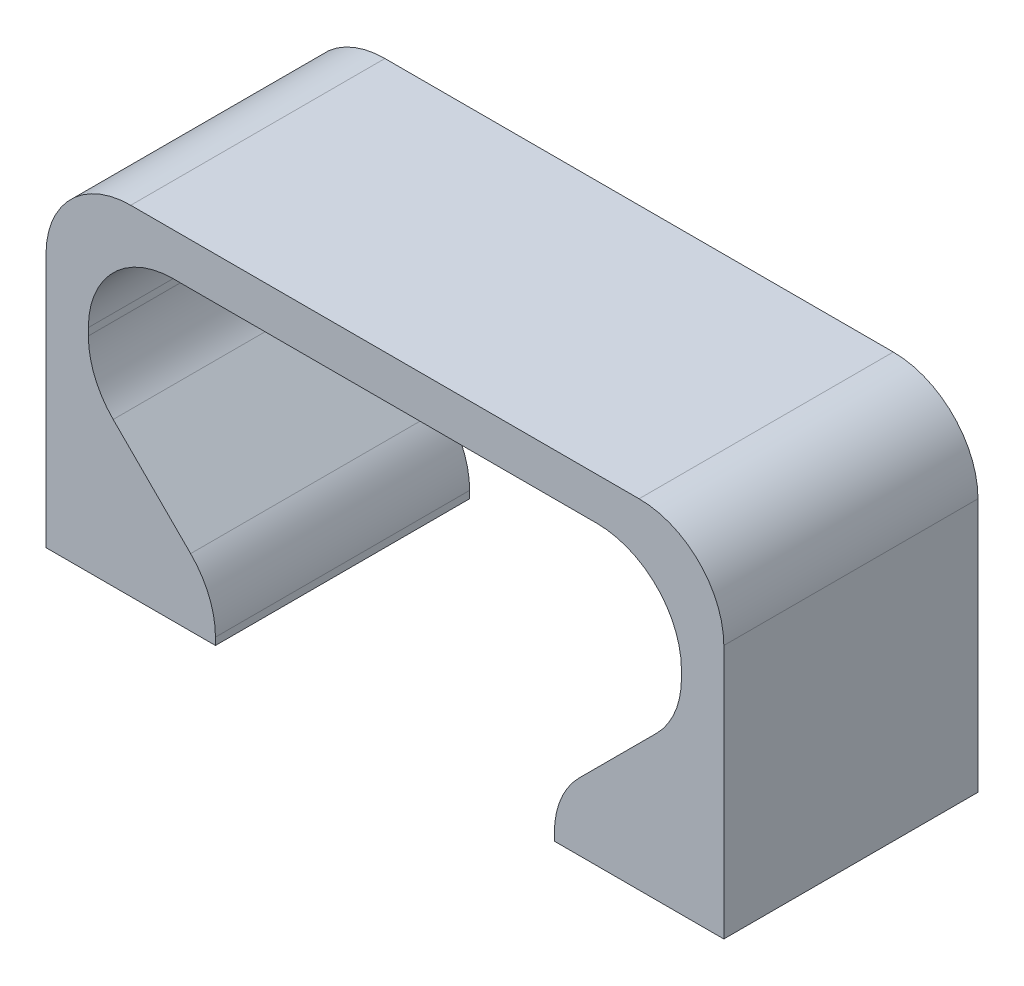
ISO-10303-21;
HEADER;
FILE_DESCRIPTION(('STEP AP214'),'2;1');
FILE_NAME('part.step','',(''),(''),'','','');
FILE_SCHEMA(('AUTOMOTIVE_DESIGN { 1 0 10303 214 1 1 1 1 }'));
ENDSEC;
DATA;
#1=APPLICATION_CONTEXT('core data for automotive mechanical design processes');
#2=APPLICATION_PROTOCOL_DEFINITION('international standard','automotive_design',2000,#1);
#3=PRODUCT_CONTEXT('',#1,'mechanical');
#4=PRODUCT('Part','Part','',(#3));
#5=PRODUCT_RELATED_PRODUCT_CATEGORY('part','',(#4));
#6=PRODUCT_DEFINITION_FORMATION('','',#4);
#7=PRODUCT_DEFINITION_CONTEXT('part definition',#1,'design');
#8=PRODUCT_DEFINITION('design','',#6,#7);
#9=PRODUCT_DEFINITION_SHAPE('','',#8);
#10=(LENGTH_UNIT() NAMED_UNIT(*) SI_UNIT(.MILLI.,.METRE.));
#11=(NAMED_UNIT(*) PLANE_ANGLE_UNIT() SI_UNIT($,.RADIAN.));
#12=(NAMED_UNIT(*) SI_UNIT($,.STERADIAN.) SOLID_ANGLE_UNIT());
#13=UNCERTAINTY_MEASURE_WITH_UNIT(LENGTH_MEASURE(1.E-05),#10,'distance_accuracy_value','');
#14=(GEOMETRIC_REPRESENTATION_CONTEXT(3) GLOBAL_UNCERTAINTY_ASSIGNED_CONTEXT((#13)) GLOBAL_UNIT_ASSIGNED_CONTEXT((#10,
#11,#12)) REPRESENTATION_CONTEXT('',''));
#15=CARTESIAN_POINT('',(0.,0.,0.));
#16=DIRECTION('',(0.,0.,1.));
#17=DIRECTION('',(1.,0.,0.));
#18=AXIS2_PLACEMENT_3D('',#15,#16,#17);
#19=CARTESIAN_POINT('',(-20.,0.,-7.5));
#20=DIRECTION('',(-1.,0.,0.));
#21=DIRECTION('',(0.,0.,1.));
#22=AXIS2_PLACEMENT_3D('',#19,#20,#21);
#23=PLANE('',#22);
#24=DIRECTION('',(0.,-1.,0.));
#25=VECTOR('',#24,1.);
#26=CARTESIAN_POINT('',(-20.,0.,7.5));
#27=LINE('',#26,#25);
#28=CARTESIAN_POINT('',(-20.,15.,7.5));
#29=VERTEX_POINT('',#28);
#30=CARTESIAN_POINT('',(-20.,0.,7.5));
#31=VERTEX_POINT('',#30);
#32=EDGE_CURVE('E173',#29,#31,#27,.T.);
#33=ORIENTED_EDGE('',*,*,#32,.F.);
#34=DIRECTION('',(0.,0.,1.));
#35=VECTOR('',#34,1.);
#36=CARTESIAN_POINT('',(-20.,15.,-7.5));
#37=LINE('',#36,#35);
#38=CARTESIAN_POINT('',(-20.,15.,-7.5));
#39=VERTEX_POINT('',#38);
#40=EDGE_CURVE('E307',#29,#39,#37,.F.);
#41=ORIENTED_EDGE('',*,*,#40,.T.);
#42=DIRECTION('',(0.,-1.,0.));
#43=VECTOR('',#42,1.);
#44=CARTESIAN_POINT('',(-20.,0.,-7.5));
#45=LINE('',#44,#43);
#46=CARTESIAN_POINT('',(-20.,0.,-7.5));
#47=VERTEX_POINT('',#46);
#48=EDGE_CURVE('E189',#39,#47,#45,.T.);
#49=ORIENTED_EDGE('',*,*,#48,.T.);
#50=DIRECTION('',(0.,0.,1.));
#51=VECTOR('',#50,1.);
#52=CARTESIAN_POINT('',(-20.,0.,-7.5));
#53=LINE('',#52,#51);
#54=EDGE_CURVE('E187',#47,#31,#53,.T.);
#55=ORIENTED_EDGE('',*,*,#54,.T.);
#56=EDGE_LOOP('',(#33,#41,#49,#55));
#57=FACE_BOUND('',#56,.T.);
#58=ADVANCED_FACE('F35',(#57),#23,.T.);
#59=CARTESIAN_POINT('',(-20.,20.,-7.5));
#60=DIRECTION('',(0.,1.,0.));
#61=DIRECTION('',(-1.,0.,0.));
#62=AXIS2_PLACEMENT_3D('',#59,#60,#61);
#63=PLANE('',#62);
#64=DIRECTION('',(-1.,0.,0.));
#65=VECTOR('',#64,1.);
#66=CARTESIAN_POINT('',(-20.,20.,7.5));
#67=LINE('',#66,#65);
#68=CARTESIAN_POINT('',(15.,20.,7.5));
#69=VERTEX_POINT('',#68);
#70=CARTESIAN_POINT('',(-15.,20.,7.5));
#71=VERTEX_POINT('',#70);
#72=EDGE_CURVE('E223',#69,#71,#67,.T.);
#73=ORIENTED_EDGE('',*,*,#72,.F.);
#74=DIRECTION('',(0.,0.,1.));
#75=VECTOR('',#74,1.);
#76=CARTESIAN_POINT('',(15.,20.,-7.5));
#77=LINE('',#76,#75);
#78=CARTESIAN_POINT('',(15.,20.,-7.5));
#79=VERTEX_POINT('',#78);
#80=EDGE_CURVE('E305',#69,#79,#77,.F.);
#81=ORIENTED_EDGE('',*,*,#80,.T.);
#82=DIRECTION('',(-1.,0.,0.));
#83=VECTOR('',#82,1.);
#84=CARTESIAN_POINT('',(-20.,20.,-7.5));
#85=LINE('',#84,#83);
#86=CARTESIAN_POINT('',(-15.,20.,-7.5));
#87=VERTEX_POINT('',#86);
#88=EDGE_CURVE('E194',#79,#87,#85,.T.);
#89=ORIENTED_EDGE('',*,*,#88,.T.);
#90=DIRECTION('',(0.,0.,1.));
#91=VECTOR('',#90,1.);
#92=CARTESIAN_POINT('',(-15.,20.,-7.5));
#93=LINE('',#92,#91);
#94=EDGE_CURVE('E302',#87,#71,#93,.T.);
#95=ORIENTED_EDGE('',*,*,#94,.T.);
#96=EDGE_LOOP('',(#73,#81,#89,#95));
#97=FACE_BOUND('',#96,.T.);
#98=ADVANCED_FACE('F358',(#97),#63,.T.);
#99=CARTESIAN_POINT('',(20.,20.,-7.5));
#100=DIRECTION('',(1.,0.,0.));
#101=DIRECTION('',(0.,1.,0.));
#102=AXIS2_PLACEMENT_3D('',#99,#100,#101);
#103=PLANE('',#102);
#104=DIRECTION('',(0.,1.,0.));
#105=VECTOR('',#104,1.);
#106=CARTESIAN_POINT('',(20.,20.,-7.5));
#107=LINE('',#106,#105);
#108=CARTESIAN_POINT('',(20.,0.,-7.5));
#109=VERTEX_POINT('',#108);
#110=CARTESIAN_POINT('',(20.,15.,-7.5));
#111=VERTEX_POINT('',#110);
#112=EDGE_CURVE('E249',#109,#111,#107,.T.);
#113=ORIENTED_EDGE('',*,*,#112,.T.);
#114=DIRECTION('',(0.,0.,1.));
#115=VECTOR('',#114,1.);
#116=CARTESIAN_POINT('',(20.,15.,-7.5));
#117=LINE('',#116,#115);
#118=CARTESIAN_POINT('',(20.,15.,7.5));
#119=VERTEX_POINT('',#118);
#120=EDGE_CURVE('E299',#111,#119,#117,.T.);
#121=ORIENTED_EDGE('',*,*,#120,.T.);
#122=DIRECTION('',(0.,1.,0.));
#123=VECTOR('',#122,1.);
#124=CARTESIAN_POINT('',(20.,20.,7.5));
#125=LINE('',#124,#123);
#126=CARTESIAN_POINT('',(20.,0.,7.5));
#127=VERTEX_POINT('',#126);
#128=EDGE_CURVE('E220',#127,#119,#125,.T.);
#129=ORIENTED_EDGE('',*,*,#128,.F.);
#130=DIRECTION('',(0.,0.,1.));
#131=VECTOR('',#130,1.);
#132=CARTESIAN_POINT('',(20.,0.,-7.5));
#133=LINE('',#132,#131);
#134=EDGE_CURVE('E254',#109,#127,#133,.T.);
#135=ORIENTED_EDGE('',*,*,#134,.F.);
#136=EDGE_LOOP('',(#113,#121,#129,#135));
#137=FACE_BOUND('',#136,.T.);
#138=ADVANCED_FACE('F366',(#137),#103,.T.);
#139=CARTESIAN_POINT('',(20.,0.,-7.5));
#140=DIRECTION('',(0.,-1.,0.));
#141=DIRECTION('',(1.,0.,0.));
#142=AXIS2_PLACEMENT_3D('',#139,#140,#141);
#143=PLANE('',#142);
#144=ORIENTED_EDGE('',*,*,#134,.T.);
#145=DIRECTION('',(1.,0.,0.));
#146=VECTOR('',#145,1.);
#147=CARTESIAN_POINT('',(20.,0.,7.5));
#148=LINE('',#147,#146);
#149=CARTESIAN_POINT('',(10.,0.,7.5));
#150=VERTEX_POINT('',#149);
#151=EDGE_CURVE('E217',#150,#127,#148,.T.);
#152=ORIENTED_EDGE('',*,*,#151,.F.);
#153=DIRECTION('',(0.,0.,1.));
#154=VECTOR('',#153,1.);
#155=CARTESIAN_POINT('',(10.,0.,-7.5));
#156=LINE('',#155,#154);
#157=CARTESIAN_POINT('',(10.,0.,-7.5));
#158=VERTEX_POINT('',#157);
#159=EDGE_CURVE('E257',#158,#150,#156,.T.);
#160=ORIENTED_EDGE('',*,*,#159,.F.);
#161=DIRECTION('',(1.,0.,0.));
#162=VECTOR('',#161,1.);
#163=CARTESIAN_POINT('',(20.,0.,-7.5));
#164=LINE('',#163,#162);
#165=EDGE_CURVE('E246',#158,#109,#164,.T.);
#166=ORIENTED_EDGE('',*,*,#165,.T.);
#167=EDGE_LOOP('',(#144,#152,#160,#166));
#168=FACE_BOUND('',#167,.T.);
#169=ADVANCED_FACE('F371',(#168),#143,.T.);
#170=CARTESIAN_POINT('',(10.,0.,-7.5));
#171=DIRECTION('',(-1.,0.,0.));
#172=DIRECTION('',(0.,0.,1.));
#173=AXIS2_PLACEMENT_3D('',#170,#171,#172);
#174=PLANE('',#173);
#175=DIRECTION('',(0.,-1.,0.));
#176=VECTOR('',#175,1.);
#177=CARTESIAN_POINT('',(10.,0.,7.5));
#178=LINE('',#177,#176);
#179=CARTESIAN_POINT('',(10.,0.428932188134523,7.5));
#180=VERTEX_POINT('',#179);
#181=EDGE_CURVE('E215',#180,#150,#178,.T.);
#182=ORIENTED_EDGE('',*,*,#181,.F.);
#183=DIRECTION('',(0.,0.,1.));
#184=VECTOR('',#183,1.);
#185=CARTESIAN_POINT('',(10.,0.428932188134523,-7.5));
#186=LINE('',#185,#184);
#187=CARTESIAN_POINT('',(10.,0.428932188134523,-7.5));
#188=VERTEX_POINT('',#187);
#189=EDGE_CURVE('E277',#180,#188,#186,.F.);
#190=ORIENTED_EDGE('',*,*,#189,.T.);
#191=DIRECTION('',(0.,-1.,0.));
#192=VECTOR('',#191,1.);
#193=CARTESIAN_POINT('',(10.,0.,-7.5));
#194=LINE('',#193,#192);
#195=EDGE_CURVE('E244',#188,#158,#194,.T.);
#196=ORIENTED_EDGE('',*,*,#195,.T.);
#197=ORIENTED_EDGE('',*,*,#159,.T.);
#198=EDGE_LOOP('',(#182,#190,#196,#197));
#199=FACE_BOUND('',#198,.T.);
#200=ADVANCED_FACE('F375',(#199),#174,.T.);
#201=CARTESIAN_POINT('',(10.,2.5,-7.5));
#202=DIRECTION('',(-0.707106781186547,0.707106781186548,0.));
#203=DIRECTION('',(-0.707106781186548,-0.707106781186547,0.));
#204=AXIS2_PLACEMENT_3D('',#201,#202,#203);
#205=PLANE('',#204);
#206=DIRECTION('',(-0.707106781186548,-0.707106781186547,0.));
#207=VECTOR('',#206,1.);
#208=CARTESIAN_POINT('',(10.,2.5,7.5));
#209=LINE('',#208,#207);
#210=CARTESIAN_POINT('',(16.0355339059327,8.53553390593274,7.5));
#211=VERTEX_POINT('',#210);
#212=CARTESIAN_POINT('',(11.4644660940673,3.96446609406726,7.5));
#213=VERTEX_POINT('',#212);
#214=EDGE_CURVE('E213',#211,#213,#209,.T.);
#215=ORIENTED_EDGE('',*,*,#214,.F.);
#216=DIRECTION('',(0.,0.,1.));
#217=VECTOR('',#216,1.);
#218=CARTESIAN_POINT('',(16.0355339059327,8.53553390593274,-7.5));
#219=LINE('',#218,#217);
#220=CARTESIAN_POINT('',(16.0355339059327,8.53553390593274,-7.5));
#221=VERTEX_POINT('',#220);
#222=EDGE_CURVE('E268',#211,#221,#219,.F.);
#223=ORIENTED_EDGE('',*,*,#222,.T.);
#224=DIRECTION('',(-0.707106781186548,-0.707106781186547,0.));
#225=VECTOR('',#224,1.);
#226=CARTESIAN_POINT('',(10.,2.5,-7.5));
#227=LINE('',#226,#225);
#228=CARTESIAN_POINT('',(11.4644660940673,3.96446609406726,-7.5));
#229=VERTEX_POINT('',#228);
#230=EDGE_CURVE('E241',#221,#229,#227,.T.);
#231=ORIENTED_EDGE('',*,*,#230,.T.);
#232=DIRECTION('',(0.,0.,1.));
#233=VECTOR('',#232,1.);
#234=CARTESIAN_POINT('',(11.4644660940673,3.96446609406726,-7.5));
#235=LINE('',#234,#233);
#236=EDGE_CURVE('E265',#229,#213,#235,.T.);
#237=ORIENTED_EDGE('',*,*,#236,.T.);
#238=EDGE_LOOP('',(#215,#223,#231,#237));
#239=FACE_BOUND('',#238,.T.);
#240=ADVANCED_FACE('F384',(#239),#205,.T.);
#241=CARTESIAN_POINT('',(17.5,10.,-7.5));
#242=DIRECTION('',(-1.,0.,0.));
#243=DIRECTION('',(0.,0.,1.));
#244=AXIS2_PLACEMENT_3D('',#241,#242,#243);
#245=PLANE('',#244);
#246=DIRECTION('',(0.,-1.,0.));
#247=VECTOR('',#246,1.);
#248=CARTESIAN_POINT('',(17.5,10.,-7.5));
#249=LINE('',#248,#247);
#250=CARTESIAN_POINT('',(17.5,12.5,-7.5));
#251=VERTEX_POINT('',#250);
#252=CARTESIAN_POINT('',(17.5,12.0710678118655,-7.5));
#253=VERTEX_POINT('',#252);
#254=EDGE_CURVE('E238',#251,#253,#249,.T.);
#255=ORIENTED_EDGE('',*,*,#254,.T.);
#256=DIRECTION('',(0.,0.,1.));
#257=VECTOR('',#256,1.);
#258=CARTESIAN_POINT('',(17.5,12.0710678118655,7.5));
#259=LINE('',#258,#257);
#260=CARTESIAN_POINT('',(17.5,12.0710678118655,7.5));
#261=VERTEX_POINT('',#260);
#262=EDGE_CURVE('E262',#253,#261,#259,.T.);
#263=ORIENTED_EDGE('',*,*,#262,.T.);
#264=DIRECTION('',(0.,-1.,0.));
#265=VECTOR('',#264,1.);
#266=CARTESIAN_POINT('',(17.5,10.,7.5));
#267=LINE('',#266,#265);
#268=CARTESIAN_POINT('',(17.5,12.5,7.5));
#269=VERTEX_POINT('',#268);
#270=EDGE_CURVE('E210',#269,#261,#267,.T.);
#271=ORIENTED_EDGE('',*,*,#270,.F.);
#272=DIRECTION('',(0.,0.,1.));
#273=VECTOR('',#272,1.);
#274=CARTESIAN_POINT('',(17.5,12.5,-7.5));
#275=LINE('',#274,#273);
#276=EDGE_CURVE('E256',#269,#251,#275,.F.);
#277=ORIENTED_EDGE('',*,*,#276,.T.);
#278=EDGE_LOOP('',(#255,#263,#271,#277));
#279=FACE_BOUND('',#278,.T.);
#280=ADVANCED_FACE('F392',(#279),#245,.T.);
#281=CARTESIAN_POINT('',(17.5,17.5,-7.5));
#282=DIRECTION('',(0.,-1.,0.));
#283=DIRECTION('',(1.,0.,0.));
#284=AXIS2_PLACEMENT_3D('',#281,#282,#283);
#285=PLANE('',#284);
#286=DIRECTION('',(1.,0.,0.));
#287=VECTOR('',#286,1.);
#288=CARTESIAN_POINT('',(17.5,17.5,-7.5));
#289=LINE('',#288,#287);
#290=CARTESIAN_POINT('',(-12.5,17.5,-7.5));
#291=VERTEX_POINT('',#290);
#292=CARTESIAN_POINT('',(12.5,17.5,-7.5));
#293=VERTEX_POINT('',#292);
#294=EDGE_CURVE('E235',#291,#293,#289,.T.);
#295=ORIENTED_EDGE('',*,*,#294,.T.);
#296=DIRECTION('',(0.,0.,1.));
#297=VECTOR('',#296,1.);
#298=CARTESIAN_POINT('',(12.5,17.5,7.5));
#299=LINE('',#298,#297);
#300=CARTESIAN_POINT('',(12.5,17.5,7.5));
#301=VERTEX_POINT('',#300);
#302=EDGE_CURVE('E311',#293,#301,#299,.T.);
#303=ORIENTED_EDGE('',*,*,#302,.T.);
#304=DIRECTION('',(1.,0.,0.));
#305=VECTOR('',#304,1.);
#306=CARTESIAN_POINT('',(17.5,17.5,7.5));
#307=LINE('',#306,#305);
#308=CARTESIAN_POINT('',(-12.5,17.5,7.5));
#309=VERTEX_POINT('',#308);
#310=EDGE_CURVE('E207',#309,#301,#307,.T.);
#311=ORIENTED_EDGE('',*,*,#310,.F.);
#312=DIRECTION('',(0.,0.,1.));
#313=VECTOR('',#312,1.);
#314=CARTESIAN_POINT('',(-12.5,17.5,-7.5));
#315=LINE('',#314,#313);
#316=EDGE_CURVE('E309',#309,#291,#315,.F.);
#317=ORIENTED_EDGE('',*,*,#316,.T.);
#318=EDGE_LOOP('',(#295,#303,#311,#317));
#319=FACE_BOUND('',#318,.T.);
#320=ADVANCED_FACE('F330',(#319),#285,.T.);
#321=CARTESIAN_POINT('',(-17.5,17.5,-7.5));
#322=DIRECTION('',(1.,0.,0.));
#323=DIRECTION('',(0.,0.,-1.));
#324=AXIS2_PLACEMENT_3D('',#321,#322,#323);
#325=PLANE('',#324);
#326=DIRECTION('',(0.,1.,0.));
#327=VECTOR('',#326,1.);
#328=CARTESIAN_POINT('',(-17.5,17.5,7.5));
#329=LINE('',#328,#327);
#330=CARTESIAN_POINT('',(-17.5,12.0710678118655,7.5));
#331=VERTEX_POINT('',#330);
#332=CARTESIAN_POINT('',(-17.5,12.5,7.5));
#333=VERTEX_POINT('',#332);
#334=EDGE_CURVE('E204',#331,#333,#329,.T.);
#335=ORIENTED_EDGE('',*,*,#334,.F.);
#336=DIRECTION('',(0.,0.,1.));
#337=VECTOR('',#336,1.);
#338=CARTESIAN_POINT('',(-17.5,12.0710678118655,-7.5));
#339=LINE('',#338,#337);
#340=CARTESIAN_POINT('',(-17.5,12.0710678118655,-7.5));
#341=VERTEX_POINT('',#340);
#342=EDGE_CURVE('E297',#331,#341,#339,.F.);
#343=ORIENTED_EDGE('',*,*,#342,.T.);
#344=DIRECTION('',(0.,1.,0.));
#345=VECTOR('',#344,1.);
#346=CARTESIAN_POINT('',(-17.5,17.5,-7.5));
#347=LINE('',#346,#345);
#348=CARTESIAN_POINT('',(-17.5,12.5,-7.5));
#349=VERTEX_POINT('',#348);
#350=EDGE_CURVE('E232',#341,#349,#347,.T.);
#351=ORIENTED_EDGE('',*,*,#350,.T.);
#352=DIRECTION('',(0.,0.,1.));
#353=VECTOR('',#352,1.);
#354=CARTESIAN_POINT('',(-17.5,12.5,7.5));
#355=LINE('',#354,#353);
#356=EDGE_CURVE('E294',#349,#333,#355,.T.);
#357=ORIENTED_EDGE('',*,*,#356,.T.);
#358=EDGE_LOOP('',(#335,#343,#351,#357));
#359=FACE_BOUND('',#358,.T.);
#360=ADVANCED_FACE('F337',(#359),#325,.T.);
#361=CARTESIAN_POINT('',(-17.5,10.,-7.5));
#362=DIRECTION('',(0.707106781186547,0.707106781186548,0.));
#363=DIRECTION('',(-0.707106781186548,0.707106781186547,0.));
#364=AXIS2_PLACEMENT_3D('',#361,#362,#363);
#365=PLANE('',#364);
#366=DIRECTION('',(-0.707106781186548,0.707106781186547,0.));
#367=VECTOR('',#366,1.);
#368=CARTESIAN_POINT('',(-17.5,10.,7.5));
#369=LINE('',#368,#367);
#370=CARTESIAN_POINT('',(-11.4644660940673,3.96446609406726,7.5));
#371=VERTEX_POINT('',#370);
#372=CARTESIAN_POINT('',(-16.0355339059327,8.53553390593273,7.5));
#373=VERTEX_POINT('',#372);
#374=EDGE_CURVE('E199',#371,#373,#369,.T.);
#375=ORIENTED_EDGE('',*,*,#374,.F.);
#376=DIRECTION('',(0.,0.,1.));
#377=VECTOR('',#376,1.);
#378=CARTESIAN_POINT('',(-11.4644660940673,3.96446609406726,-7.5));
#379=LINE('',#378,#377);
#380=CARTESIAN_POINT('',(-11.4644660940673,3.96446609406726,-7.5));
#381=VERTEX_POINT('',#380);
#382=EDGE_CURVE('E292',#371,#381,#379,.F.);
#383=ORIENTED_EDGE('',*,*,#382,.T.);
#384=DIRECTION('',(-0.707106781186548,0.707106781186547,0.));
#385=VECTOR('',#384,1.);
#386=CARTESIAN_POINT('',(-17.5,10.,-7.5));
#387=LINE('',#386,#385);
#388=CARTESIAN_POINT('',(-16.0355339059327,8.53553390593273,-7.5));
#389=VERTEX_POINT('',#388);
#390=EDGE_CURVE('E230',#381,#389,#387,.T.);
#391=ORIENTED_EDGE('',*,*,#390,.T.);
#392=DIRECTION('',(0.,0.,1.));
#393=VECTOR('',#392,1.);
#394=CARTESIAN_POINT('',(-16.0355339059327,8.53553390593273,7.5));
#395=LINE('',#394,#393);
#396=EDGE_CURVE('E289',#389,#373,#395,.T.);
#397=ORIENTED_EDGE('',*,*,#396,.T.);
#398=EDGE_LOOP('',(#375,#383,#391,#397));
#399=FACE_BOUND('',#398,.T.);
#400=ADVANCED_FACE('F344',(#399),#365,.T.);
#401=CARTESIAN_POINT('',(-10.,2.5,-7.5));
#402=DIRECTION('',(1.,0.,0.));
#403=DIRECTION('',(0.,0.,-1.));
#404=AXIS2_PLACEMENT_3D('',#401,#402,#403);
#405=PLANE('',#404);
#406=DIRECTION('',(0.,1.,0.));
#407=VECTOR('',#406,1.);
#408=CARTESIAN_POINT('',(-10.,2.5,-7.5));
#409=LINE('',#408,#407);
#410=CARTESIAN_POINT('',(-10.,0.,-7.5));
#411=VERTEX_POINT('',#410);
#412=CARTESIAN_POINT('',(-10.,0.428932188134523,-7.5));
#413=VERTEX_POINT('',#412);
#414=EDGE_CURVE('E228',#411,#413,#409,.T.);
#415=ORIENTED_EDGE('',*,*,#414,.T.);
#416=DIRECTION('',(0.,0.,1.));
#417=VECTOR('',#416,1.);
#418=CARTESIAN_POINT('',(-10.,0.428932188134523,-7.5));
#419=LINE('',#418,#417);
#420=CARTESIAN_POINT('',(-10.,0.428932188134523,7.5));
#421=VERTEX_POINT('',#420);
#422=EDGE_CURVE('E286',#413,#421,#419,.T.);
#423=ORIENTED_EDGE('',*,*,#422,.T.);
#424=DIRECTION('',(0.,1.,0.));
#425=VECTOR('',#424,1.);
#426=CARTESIAN_POINT('',(-10.,2.5,7.5));
#427=LINE('',#426,#425);
#428=CARTESIAN_POINT('',(-10.,0.,7.5));
#429=VERTEX_POINT('',#428);
#430=EDGE_CURVE('E197',#429,#421,#427,.T.);
#431=ORIENTED_EDGE('',*,*,#430,.F.);
#432=DIRECTION('',(0.,0.,1.));
#433=VECTOR('',#432,1.);
#434=CARTESIAN_POINT('',(-10.,0.,-7.5));
#435=LINE('',#434,#433);
#436=EDGE_CURVE('E193',#411,#429,#435,.T.);
#437=ORIENTED_EDGE('',*,*,#436,.F.);
#438=EDGE_LOOP('',(#415,#423,#431,#437));
#439=FACE_BOUND('',#438,.T.);
#440=ADVANCED_FACE('F350',(#439),#405,.T.);
#441=CARTESIAN_POINT('',(-10.,0.,-7.5));
#442=DIRECTION('',(0.,-1.,0.));
#443=DIRECTION('',(1.,0.,0.));
#444=AXIS2_PLACEMENT_3D('',#441,#442,#443);
#445=PLANE('',#444);
#446=ORIENTED_EDGE('',*,*,#436,.T.);
#447=DIRECTION('',(1.,0.,0.));
#448=VECTOR('',#447,1.);
#449=CARTESIAN_POINT('',(-10.,0.,7.5));
#450=LINE('',#449,#448);
#451=EDGE_CURVE('E179',#31,#429,#450,.T.);
#452=ORIENTED_EDGE('',*,*,#451,.F.);
#453=ORIENTED_EDGE('',*,*,#54,.F.);
#454=DIRECTION('',(1.,0.,0.));
#455=VECTOR('',#454,1.);
#456=CARTESIAN_POINT('',(-10.,0.,-7.5));
#457=LINE('',#456,#455);
#458=EDGE_CURVE('E226',#47,#411,#457,.T.);
#459=ORIENTED_EDGE('',*,*,#458,.T.);
#460=EDGE_LOOP('',(#446,#452,#453,#459));
#461=FACE_BOUND('',#460,.T.);
#462=ADVANCED_FACE('F196',(#461),#445,.T.);
#463=CARTESIAN_POINT('',(0.,0.,-7.5));
#464=DIRECTION('',(0.,0.,-1.));
#465=DIRECTION('',(-1.,0.,0.));
#466=AXIS2_PLACEMENT_3D('',#463,#464,#465);
#467=PLANE('',#466);
#468=ORIENTED_EDGE('',*,*,#195,.F.);
#469=CARTESIAN_POINT('',(15.,0.428932188134523,-7.5));
#470=DIRECTION('',(0.,0.,-1.));
#471=DIRECTION('',(-1.,0.,0.));
#472=AXIS2_PLACEMENT_3D('',#469,#470,#471);
#473=CIRCLE('',#472,5.);
#474=EDGE_CURVE('E284',#188,#229,#473,.T.);
#475=ORIENTED_EDGE('',*,*,#474,.T.);
#476=ORIENTED_EDGE('',*,*,#230,.F.);
#477=CARTESIAN_POINT('',(12.5,12.0710678118655,-7.5));
#478=DIRECTION('',(0.,0.,-1.));
#479=DIRECTION('',(-1.,0.,0.));
#480=AXIS2_PLACEMENT_3D('',#477,#478,#479);
#481=CIRCLE('',#480,5.);
#482=EDGE_CURVE('E316',#221,#253,#481,.F.);
#483=ORIENTED_EDGE('',*,*,#482,.T.);
#484=ORIENTED_EDGE('',*,*,#254,.F.);
#485=CARTESIAN_POINT('',(12.5,12.5,-7.5));
#486=DIRECTION('',(0.,0.,-1.));
#487=DIRECTION('',(-1.,0.,0.));
#488=AXIS2_PLACEMENT_3D('',#485,#486,#487);
#489=CIRCLE('',#488,5.);
#490=EDGE_CURVE('E323',#251,#293,#489,.F.);
#491=ORIENTED_EDGE('',*,*,#490,.T.);
#492=ORIENTED_EDGE('',*,*,#294,.F.);
#493=CARTESIAN_POINT('',(-12.5,12.5,-7.5));
#494=DIRECTION('',(0.,0.,-1.));
#495=DIRECTION('',(-1.,0.,0.));
#496=AXIS2_PLACEMENT_3D('',#493,#494,#495);
#497=CIRCLE('',#496,5.);
#498=EDGE_CURVE('E11',#291,#349,#497,.F.);
#499=ORIENTED_EDGE('',*,*,#498,.T.);
#500=ORIENTED_EDGE('',*,*,#350,.F.);
#501=CARTESIAN_POINT('',(-12.5,12.0710678118655,-7.5));
#502=DIRECTION('',(0.,0.,-1.));
#503=DIRECTION('',(-1.,0.,0.));
#504=AXIS2_PLACEMENT_3D('',#501,#502,#503);
#505=CIRCLE('',#504,5.);
#506=EDGE_CURVE('E56',#341,#389,#505,.F.);
#507=ORIENTED_EDGE('',*,*,#506,.T.);
#508=ORIENTED_EDGE('',*,*,#390,.F.);
#509=CARTESIAN_POINT('',(-15.,0.428932188134523,-7.5));
#510=DIRECTION('',(0.,0.,-1.));
#511=DIRECTION('',(-1.,0.,0.));
#512=AXIS2_PLACEMENT_3D('',#509,#510,#511);
#513=CIRCLE('',#512,5.);
#514=EDGE_CURVE('E50',#381,#413,#513,.T.);
#515=ORIENTED_EDGE('',*,*,#514,.T.);
#516=ORIENTED_EDGE('',*,*,#414,.F.);
#517=ORIENTED_EDGE('',*,*,#458,.F.);
#518=ORIENTED_EDGE('',*,*,#48,.F.);
#519=CARTESIAN_POINT('',(-15.,15.,-7.5));
#520=DIRECTION('',(0.,0.,-1.));
#521=DIRECTION('',(-1.,0.,0.));
#522=AXIS2_PLACEMENT_3D('',#519,#520,#521);
#523=CIRCLE('',#522,5.);
#524=EDGE_CURVE('E279',#39,#87,#523,.T.);
#525=ORIENTED_EDGE('',*,*,#524,.T.);
#526=ORIENTED_EDGE('',*,*,#88,.F.);
#527=CARTESIAN_POINT('',(15.,15.,-7.5));
#528=DIRECTION('',(0.,0.,-1.));
#529=DIRECTION('',(-1.,0.,0.));
#530=AXIS2_PLACEMENT_3D('',#527,#528,#529);
#531=CIRCLE('',#530,5.);
#532=EDGE_CURVE('E281',#79,#111,#531,.T.);
#533=ORIENTED_EDGE('',*,*,#532,.T.);
#534=ORIENTED_EDGE('',*,*,#112,.F.);
#535=ORIENTED_EDGE('',*,*,#165,.F.);
#536=EDGE_LOOP('',(#468,#475,#476,#483,#484,#491,#492,#499,#500,#507,#508,#515,#516,#517,#518,
#525,#526,#533,#534,#535));
#537=FACE_BOUND('',#536,.T.);
#538=ADVANCED_FACE('F335',(#537),#467,.T.);
#539=CARTESIAN_POINT('',(0.,0.,7.5));
#540=DIRECTION('',(0.,0.,-1.));
#541=DIRECTION('',(-1.,0.,0.));
#542=AXIS2_PLACEMENT_3D('',#539,#540,#541);
#543=PLANE('',#542);
#544=ORIENTED_EDGE('',*,*,#214,.T.);
#545=CARTESIAN_POINT('',(15.,0.428932188134523,7.5));
#546=DIRECTION('',(0.,0.,-1.));
#547=DIRECTION('',(-1.,0.,0.));
#548=AXIS2_PLACEMENT_3D('',#545,#546,#547);
#549=CIRCLE('',#548,5.);
#550=EDGE_CURVE('E275',#213,#180,#549,.F.);
#551=ORIENTED_EDGE('',*,*,#550,.T.);
#552=ORIENTED_EDGE('',*,*,#181,.T.);
#553=ORIENTED_EDGE('',*,*,#151,.T.);
#554=ORIENTED_EDGE('',*,*,#128,.T.);
#555=CARTESIAN_POINT('',(15.,15.,7.5));
#556=DIRECTION('',(0.,0.,-1.));
#557=DIRECTION('',(-1.,0.,0.));
#558=AXIS2_PLACEMENT_3D('',#555,#556,#557);
#559=CIRCLE('',#558,5.);
#560=EDGE_CURVE('E271',#119,#69,#559,.F.);
#561=ORIENTED_EDGE('',*,*,#560,.T.);
#562=ORIENTED_EDGE('',*,*,#72,.T.);
#563=CARTESIAN_POINT('',(-15.,15.,7.5));
#564=DIRECTION('',(0.,0.,-1.));
#565=DIRECTION('',(-1.,0.,0.));
#566=AXIS2_PLACEMENT_3D('',#563,#564,#565);
#567=CIRCLE('',#566,5.);
#568=EDGE_CURVE('E182',#71,#29,#567,.F.);
#569=ORIENTED_EDGE('',*,*,#568,.T.);
#570=ORIENTED_EDGE('',*,*,#32,.T.);
#571=ORIENTED_EDGE('',*,*,#451,.T.);
#572=ORIENTED_EDGE('',*,*,#430,.T.);
#573=CARTESIAN_POINT('',(-15.,0.428932188134523,7.5));
#574=DIRECTION('',(0.,0.,-1.));
#575=DIRECTION('',(-1.,0.,0.));
#576=AXIS2_PLACEMENT_3D('',#573,#574,#575);
#577=CIRCLE('',#576,5.);
#578=EDGE_CURVE('E273',#421,#371,#577,.F.);
#579=ORIENTED_EDGE('',*,*,#578,.T.);
#580=ORIENTED_EDGE('',*,*,#374,.T.);
#581=CARTESIAN_POINT('',(-12.5,12.0710678118655,7.5));
#582=DIRECTION('',(0.,0.,-1.));
#583=DIRECTION('',(-1.,0.,0.));
#584=AXIS2_PLACEMENT_3D('',#581,#582,#583);
#585=CIRCLE('',#584,5.);
#586=EDGE_CURVE('E318',#373,#331,#585,.T.);
#587=ORIENTED_EDGE('',*,*,#586,.T.);
#588=ORIENTED_EDGE('',*,*,#334,.T.);
#589=CARTESIAN_POINT('',(-12.5,12.5,7.5));
#590=DIRECTION('',(0.,0.,-1.));
#591=DIRECTION('',(-1.,0.,0.));
#592=AXIS2_PLACEMENT_3D('',#589,#590,#591);
#593=CIRCLE('',#592,5.);
#594=EDGE_CURVE('E43',#333,#309,#593,.T.);
#595=ORIENTED_EDGE('',*,*,#594,.T.);
#596=ORIENTED_EDGE('',*,*,#310,.T.);
#597=CARTESIAN_POINT('',(12.5,12.5,7.5));
#598=DIRECTION('',(0.,0.,-1.));
#599=DIRECTION('',(-1.,0.,0.));
#600=AXIS2_PLACEMENT_3D('',#597,#598,#599);
#601=CIRCLE('',#600,5.);
#602=EDGE_CURVE('E321',#301,#269,#601,.T.);
#603=ORIENTED_EDGE('',*,*,#602,.T.);
#604=ORIENTED_EDGE('',*,*,#270,.T.);
#605=CARTESIAN_POINT('',(12.5,12.0710678118655,7.5));
#606=DIRECTION('',(0.,0.,-1.));
#607=DIRECTION('',(-1.,0.,0.));
#608=AXIS2_PLACEMENT_3D('',#605,#606,#607);
#609=CIRCLE('',#608,5.);
#610=EDGE_CURVE('E314',#261,#211,#609,.T.);
#611=ORIENTED_EDGE('',*,*,#610,.T.);
#612=EDGE_LOOP('',(#544,#551,#552,#553,#554,#561,#562,#569,#570,#571,#572,#579,#580,#587,#588,
#595,#596,#603,#604,#611));
#613=FACE_BOUND('',#612,.T.);
#614=ADVANCED_FACE('F176',(#613),#543,.F.);
#615=CARTESIAN_POINT('',(12.5,12.0710678118655,-7.5));
#616=DIRECTION('',(0.,0.,-1.));
#617=DIRECTION('',(-1.,0.,0.));
#618=AXIS2_PLACEMENT_3D('',#615,#616,#617);
#619=CYLINDRICAL_SURFACE('',#618,5.);
#620=ORIENTED_EDGE('',*,*,#482,.F.);
#621=ORIENTED_EDGE('',*,*,#222,.F.);
#622=ORIENTED_EDGE('',*,*,#610,.F.);
#623=ORIENTED_EDGE('',*,*,#262,.F.);
#624=EDGE_LOOP('',(#620,#621,#622,#623));
#625=FACE_BOUND('',#624,.T.);
#626=ADVANCED_FACE('F390',(#625),#619,.F.);
#627=CARTESIAN_POINT('',(15.,0.428932188134523,-7.5));
#628=DIRECTION('',(0.,0.,1.));
#629=DIRECTION('',(1.,0.,0.));
#630=AXIS2_PLACEMENT_3D('',#627,#628,#629);
#631=CYLINDRICAL_SURFACE('',#630,5.);
#632=ORIENTED_EDGE('',*,*,#474,.F.);
#633=ORIENTED_EDGE('',*,*,#189,.F.);
#634=ORIENTED_EDGE('',*,*,#550,.F.);
#635=ORIENTED_EDGE('',*,*,#236,.F.);
#636=EDGE_LOOP('',(#632,#633,#634,#635));
#637=FACE_BOUND('',#636,.T.);
#638=ADVANCED_FACE('F381',(#637),#631,.T.);
#639=CARTESIAN_POINT('',(-15.,0.428932188134523,-7.5));
#640=DIRECTION('',(0.,0.,1.));
#641=DIRECTION('',(1.,0.,0.));
#642=AXIS2_PLACEMENT_3D('',#639,#640,#641);
#643=CYLINDRICAL_SURFACE('',#642,5.);
#644=ORIENTED_EDGE('',*,*,#514,.F.);
#645=ORIENTED_EDGE('',*,*,#382,.F.);
#646=ORIENTED_EDGE('',*,*,#578,.F.);
#647=ORIENTED_EDGE('',*,*,#422,.F.);
#648=EDGE_LOOP('',(#644,#645,#646,#647));
#649=FACE_BOUND('',#648,.T.);
#650=ADVANCED_FACE('F348',(#649),#643,.T.);
#651=CARTESIAN_POINT('',(-12.5,12.0710678118655,-7.5));
#652=DIRECTION('',(0.,0.,-1.));
#653=DIRECTION('',(-1.,0.,0.));
#654=AXIS2_PLACEMENT_3D('',#651,#652,#653);
#655=CYLINDRICAL_SURFACE('',#654,5.);
#656=ORIENTED_EDGE('',*,*,#506,.F.);
#657=ORIENTED_EDGE('',*,*,#342,.F.);
#658=ORIENTED_EDGE('',*,*,#586,.F.);
#659=ORIENTED_EDGE('',*,*,#396,.F.);
#660=EDGE_LOOP('',(#656,#657,#658,#659));
#661=FACE_BOUND('',#660,.T.);
#662=ADVANCED_FACE('F340',(#661),#655,.F.);
#663=CARTESIAN_POINT('',(15.,15.,-7.5));
#664=DIRECTION('',(0.,0.,1.));
#665=DIRECTION('',(1.,0.,0.));
#666=AXIS2_PLACEMENT_3D('',#663,#664,#665);
#667=CYLINDRICAL_SURFACE('',#666,5.);
#668=ORIENTED_EDGE('',*,*,#532,.F.);
#669=ORIENTED_EDGE('',*,*,#80,.F.);
#670=ORIENTED_EDGE('',*,*,#560,.F.);
#671=ORIENTED_EDGE('',*,*,#120,.F.);
#672=EDGE_LOOP('',(#668,#669,#670,#671));
#673=FACE_BOUND('',#672,.T.);
#674=ADVANCED_FACE('F364',(#673),#667,.T.);
#675=CARTESIAN_POINT('',(-15.,15.,-7.5));
#676=DIRECTION('',(0.,0.,1.));
#677=DIRECTION('',(1.,0.,0.));
#678=AXIS2_PLACEMENT_3D('',#675,#676,#677);
#679=CYLINDRICAL_SURFACE('',#678,5.);
#680=ORIENTED_EDGE('',*,*,#524,.F.);
#681=ORIENTED_EDGE('',*,*,#40,.F.);
#682=ORIENTED_EDGE('',*,*,#568,.F.);
#683=ORIENTED_EDGE('',*,*,#94,.F.);
#684=EDGE_LOOP('',(#680,#681,#682,#683));
#685=FACE_BOUND('',#684,.T.);
#686=ADVANCED_FACE('F355',(#685),#679,.T.);
#687=CARTESIAN_POINT('',(12.5,12.5,-7.5));
#688=DIRECTION('',(0.,0.,-1.));
#689=DIRECTION('',(-1.,0.,0.));
#690=AXIS2_PLACEMENT_3D('',#687,#688,#689);
#691=CYLINDRICAL_SURFACE('',#690,5.);
#692=ORIENTED_EDGE('',*,*,#490,.F.);
#693=ORIENTED_EDGE('',*,*,#276,.F.);
#694=ORIENTED_EDGE('',*,*,#602,.F.);
#695=ORIENTED_EDGE('',*,*,#302,.F.);
#696=EDGE_LOOP('',(#692,#693,#694,#695));
#697=FACE_BOUND('',#696,.T.);
#698=ADVANCED_FACE('F397',(#697),#691,.F.);
#699=CARTESIAN_POINT('',(-12.5,12.5,-7.5));
#700=DIRECTION('',(0.,0.,-1.));
#701=DIRECTION('',(-1.,0.,0.));
#702=AXIS2_PLACEMENT_3D('',#699,#700,#701);
#703=CYLINDRICAL_SURFACE('',#702,5.);
#704=ORIENTED_EDGE('',*,*,#498,.F.);
#705=ORIENTED_EDGE('',*,*,#316,.F.);
#706=ORIENTED_EDGE('',*,*,#594,.F.);
#707=ORIENTED_EDGE('',*,*,#356,.F.);
#708=EDGE_LOOP('',(#704,#705,#706,#707));
#709=FACE_BOUND('',#708,.T.);
#710=ADVANCED_FACE('F37',(#709),#703,.F.);
#711=CLOSED_SHELL('',(#58,#98,#138,#169,#200,#240,#280,#320,#360,#400,#440,#462,#538,#614,#626,
#638,#650,#662,#674,#686,#698,#710));
#712=MANIFOLD_SOLID_BREP('B2',#711);
#713=ADVANCED_BREP_SHAPE_REPRESENTATION('',(#18,#712),#14);
#714=SHAPE_DEFINITION_REPRESENTATION(#9,#713);
ENDSEC;
END-ISO-10303-21;
